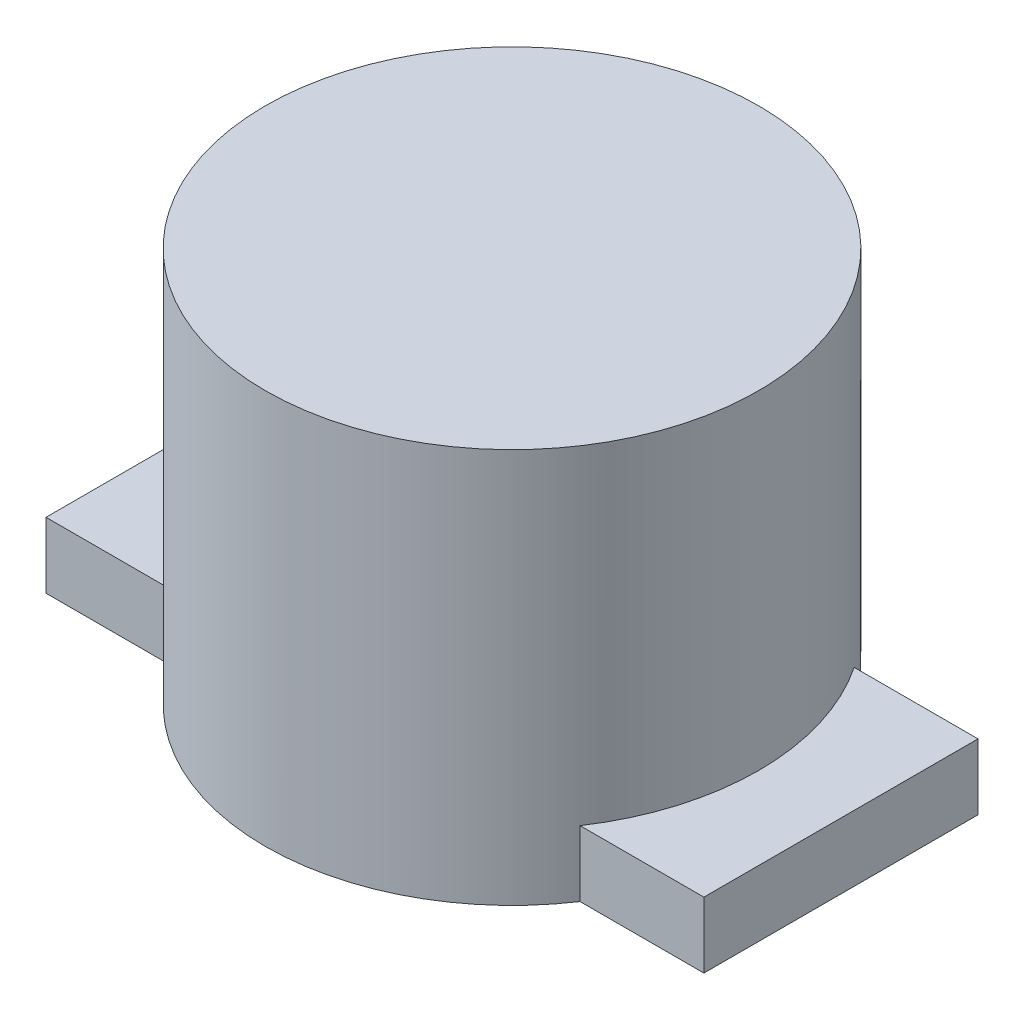
ISO-10303-21;
HEADER;
FILE_DESCRIPTION(('STEP AP214'),'2;1');
FILE_NAME('part.step','',(''),(''),'','','');
FILE_SCHEMA(('AUTOMOTIVE_DESIGN { 1 0 10303 214 1 1 1 1 }'));
ENDSEC;
DATA;
#1=APPLICATION_CONTEXT('core data for automotive mechanical design processes');
#2=APPLICATION_PROTOCOL_DEFINITION('international standard','automotive_design',2000,#1);
#3=PRODUCT_CONTEXT('',#1,'mechanical');
#4=PRODUCT('Part','Part','',(#3));
#5=PRODUCT_RELATED_PRODUCT_CATEGORY('part','',(#4));
#6=PRODUCT_DEFINITION_FORMATION('','',#4);
#7=PRODUCT_DEFINITION_CONTEXT('part definition',#1,'design');
#8=PRODUCT_DEFINITION('design','',#6,#7);
#9=PRODUCT_DEFINITION_SHAPE('','',#8);
#10=(LENGTH_UNIT() NAMED_UNIT(*) SI_UNIT(.MILLI.,.METRE.));
#11=(NAMED_UNIT(*) PLANE_ANGLE_UNIT() SI_UNIT($,.RADIAN.));
#12=(NAMED_UNIT(*) SI_UNIT($,.STERADIAN.) SOLID_ANGLE_UNIT());
#13=UNCERTAINTY_MEASURE_WITH_UNIT(LENGTH_MEASURE(1.E-05),#10,'distance_accuracy_value','');
#14=(GEOMETRIC_REPRESENTATION_CONTEXT(3) GLOBAL_UNCERTAINTY_ASSIGNED_CONTEXT((#13)) GLOBAL_UNIT_ASSIGNED_CONTEXT((#10,
#11,#12)) REPRESENTATION_CONTEXT('',''));
#15=CARTESIAN_POINT('',(0.,0.,0.));
#16=DIRECTION('',(0.,0.,1.));
#17=DIRECTION('',(1.,0.,0.));
#18=AXIS2_PLACEMENT_3D('',#15,#16,#17);
#19=CARTESIAN_POINT('',(-6.,1.2,-2.5));
#20=DIRECTION('',(0.,1.,0.));
#21=DIRECTION('',(0.,0.,1.));
#22=AXIS2_PLACEMENT_3D('',#19,#20,#21);
#23=PLANE('',#22);
#24=CARTESIAN_POINT('',(-6.,1.2,-2.5));
#25=DIRECTION('',(0.,1.,0.));
#26=DIRECTION('',(0.,0.,1.));
#27=AXIS2_PLACEMENT_3D('',#24,#25,#26);
#28=CIRCLE('',#27,4.5);
#29=CARTESIAN_POINT('',(-2.25834261322606,1.2,0.));
#30=VERTEX_POINT('',#29);
#31=CARTESIAN_POINT('',(-2.25834261322606,1.2,-5.));
#32=VERTEX_POINT('',#31);
#33=EDGE_CURVE('E165',#30,#32,#28,.T.);
#34=ORIENTED_EDGE('',*,*,#33,.F.);
#35=DIRECTION('',(1.,0.,0.));
#36=VECTOR('',#35,1.);
#37=CARTESIAN_POINT('',(-2.25834261322606,1.2,0.));
#38=LINE('',#37,#36);
#39=CARTESIAN_POINT('',(0.,1.2,0.));
#40=VERTEX_POINT('',#39);
#41=EDGE_CURVE('E153',#30,#40,#38,.T.);
#42=ORIENTED_EDGE('',*,*,#41,.T.);
#43=DIRECTION('',(0.,0.,-1.));
#44=VECTOR('',#43,1.);
#45=CARTESIAN_POINT('',(0.,1.2,0.));
#46=LINE('',#45,#44);
#47=CARTESIAN_POINT('',(0.,1.2,-5.));
#48=VERTEX_POINT('',#47);
#49=EDGE_CURVE('E99',#40,#48,#46,.T.);
#50=ORIENTED_EDGE('',*,*,#49,.T.);
#51=DIRECTION('',(-1.,0.,0.));
#52=VECTOR('',#51,1.);
#53=CARTESIAN_POINT('',(-2.25834261322606,1.2,-5.));
#54=LINE('',#53,#52);
#55=EDGE_CURVE('E119',#48,#32,#54,.T.);
#56=ORIENTED_EDGE('',*,*,#55,.T.);
#57=EDGE_LOOP('',(#34,#42,#50,#56));
#58=FACE_BOUND('',#57,.T.);
#59=ADVANCED_FACE('F35',(#58),#23,.T.);
#60=CARTESIAN_POINT('',(-2.25834261322606,1.2,0.));
#61=DIRECTION('',(0.,0.,-1.));
#62=DIRECTION('',(-1.,0.,0.));
#63=AXIS2_PLACEMENT_3D('',#60,#61,#62);
#64=PLANE('',#63);
#65=DIRECTION('',(1.,0.,0.));
#66=VECTOR('',#65,1.);
#67=CARTESIAN_POINT('',(-2.25834261322606,0.,0.));
#68=LINE('',#67,#66);
#69=CARTESIAN_POINT('',(-2.25834261322606,0.,0.));
#70=VERTEX_POINT('',#69);
#71=CARTESIAN_POINT('',(0.,0.,0.));
#72=VERTEX_POINT('',#71);
#73=EDGE_CURVE('E138',#70,#72,#68,.T.);
#74=ORIENTED_EDGE('',*,*,#73,.T.);
#75=DIRECTION('',(0.,-1.,0.));
#76=VECTOR('',#75,1.);
#77=CARTESIAN_POINT('',(0.,1.2,0.));
#78=LINE('',#77,#76);
#79=EDGE_CURVE('E45',#40,#72,#78,.T.);
#80=ORIENTED_EDGE('',*,*,#79,.F.);
#81=ORIENTED_EDGE('',*,*,#41,.F.);
#82=DIRECTION('',(0.,-1.,0.));
#83=VECTOR('',#82,1.);
#84=CARTESIAN_POINT('',(-2.25834261322606,1.2,0.));
#85=LINE('',#84,#83);
#86=EDGE_CURVE('E133',#30,#70,#85,.T.);
#87=ORIENTED_EDGE('',*,*,#86,.T.);
#88=EDGE_LOOP('',(#74,#80,#81,#87));
#89=FACE_BOUND('',#88,.T.);
#90=ADVANCED_FACE('F37',(#89),#64,.F.);
#91=CARTESIAN_POINT('',(0.,1.2,0.));
#92=DIRECTION('',(-1.,0.,0.));
#93=DIRECTION('',(0.,0.,1.));
#94=AXIS2_PLACEMENT_3D('',#91,#92,#93);
#95=PLANE('',#94);
#96=DIRECTION('',(0.,0.,-1.));
#97=VECTOR('',#96,1.);
#98=CARTESIAN_POINT('',(0.,0.,0.));
#99=LINE('',#98,#97);
#100=CARTESIAN_POINT('',(0.,0.,-5.));
#101=VERTEX_POINT('',#100);
#102=EDGE_CURVE('E141',#72,#101,#99,.T.);
#103=ORIENTED_EDGE('',*,*,#102,.T.);
#104=DIRECTION('',(0.,-1.,0.));
#105=VECTOR('',#104,1.);
#106=CARTESIAN_POINT('',(0.,1.2,-5.));
#107=LINE('',#106,#105);
#108=EDGE_CURVE('E156',#48,#101,#107,.T.);
#109=ORIENTED_EDGE('',*,*,#108,.F.);
#110=ORIENTED_EDGE('',*,*,#49,.F.);
#111=ORIENTED_EDGE('',*,*,#79,.T.);
#112=EDGE_LOOP('',(#103,#109,#110,#111));
#113=FACE_BOUND('',#112,.T.);
#114=ADVANCED_FACE('F219',(#113),#95,.F.);
#115=CARTESIAN_POINT('',(-2.25834261322606,1.2,-5.));
#116=DIRECTION('',(0.,0.,1.));
#117=DIRECTION('',(1.,0.,0.));
#118=AXIS2_PLACEMENT_3D('',#115,#116,#117);
#119=PLANE('',#118);
#120=DIRECTION('',(-1.,0.,0.));
#121=VECTOR('',#120,1.);
#122=CARTESIAN_POINT('',(-2.25834261322606,0.,-5.));
#123=LINE('',#122,#121);
#124=CARTESIAN_POINT('',(-2.25834261322606,0.,-5.));
#125=VERTEX_POINT('',#124);
#126=EDGE_CURVE('E144',#101,#125,#123,.T.);
#127=ORIENTED_EDGE('',*,*,#126,.T.);
#128=DIRECTION('',(0.,-1.,0.));
#129=VECTOR('',#128,1.);
#130=CARTESIAN_POINT('',(-2.25834261322606,1.2,-5.));
#131=LINE('',#130,#129);
#132=EDGE_CURVE('E159',#32,#125,#131,.T.);
#133=ORIENTED_EDGE('',*,*,#132,.F.);
#134=ORIENTED_EDGE('',*,*,#55,.F.);
#135=ORIENTED_EDGE('',*,*,#108,.T.);
#136=EDGE_LOOP('',(#127,#133,#134,#135));
#137=FACE_BOUND('',#136,.T.);
#138=ADVANCED_FACE('F257',(#137),#119,.F.);
#139=CARTESIAN_POINT('',(-9.74165738677394,1.2,-5.));
#140=DIRECTION('',(0.,0.,1.));
#141=DIRECTION('',(1.,0.,0.));
#142=AXIS2_PLACEMENT_3D('',#139,#140,#141);
#143=PLANE('',#142);
#144=DIRECTION('',(-1.,0.,0.));
#145=VECTOR('',#144,1.);
#146=CARTESIAN_POINT('',(-9.74165738677394,0.,-5.));
#147=LINE('',#146,#145);
#148=CARTESIAN_POINT('',(-9.74165738677394,0.,-5.));
#149=VERTEX_POINT('',#148);
#150=CARTESIAN_POINT('',(-12.,0.,-5.));
#151=VERTEX_POINT('',#150);
#152=EDGE_CURVE('E125',#149,#151,#147,.T.);
#153=ORIENTED_EDGE('',*,*,#152,.T.);
#154=DIRECTION('',(0.,-1.,0.));
#155=VECTOR('',#154,1.);
#156=CARTESIAN_POINT('',(-12.,1.2,-5.));
#157=LINE('',#156,#155);
#158=CARTESIAN_POINT('',(-12.,1.2,-5.));
#159=VERTEX_POINT('',#158);
#160=EDGE_CURVE('E122',#159,#151,#157,.T.);
#161=ORIENTED_EDGE('',*,*,#160,.F.);
#162=DIRECTION('',(-1.,0.,0.));
#163=VECTOR('',#162,1.);
#164=CARTESIAN_POINT('',(-9.74165738677394,1.2,-5.));
#165=LINE('',#164,#163);
#166=CARTESIAN_POINT('',(-9.74165738677394,1.2,-5.));
#167=VERTEX_POINT('',#166);
#168=EDGE_CURVE('E110',#167,#159,#165,.T.);
#169=ORIENTED_EDGE('',*,*,#168,.F.);
#170=DIRECTION('',(0.,-1.,0.));
#171=VECTOR('',#170,1.);
#172=CARTESIAN_POINT('',(-9.74165738677394,1.2,-5.));
#173=LINE('',#172,#171);
#174=EDGE_CURVE('E128',#167,#149,#173,.T.);
#175=ORIENTED_EDGE('',*,*,#174,.T.);
#176=EDGE_LOOP('',(#153,#161,#169,#175));
#177=FACE_BOUND('',#176,.T.);
#178=ADVANCED_FACE('F123',(#177),#143,.F.);
#179=CARTESIAN_POINT('',(-12.,1.2,0.));
#180=DIRECTION('',(1.,0.,0.));
#181=DIRECTION('',(0.,0.,-1.));
#182=AXIS2_PLACEMENT_3D('',#179,#180,#181);
#183=PLANE('',#182);
#184=DIRECTION('',(0.,0.,1.));
#185=VECTOR('',#184,1.);
#186=CARTESIAN_POINT('',(-12.,0.,0.));
#187=LINE('',#186,#185);
#188=CARTESIAN_POINT('',(-12.,0.,0.));
#189=VERTEX_POINT('',#188);
#190=EDGE_CURVE('E149',#151,#189,#187,.T.);
#191=ORIENTED_EDGE('',*,*,#190,.T.);
#192=DIRECTION('',(0.,-1.,0.));
#193=VECTOR('',#192,1.);
#194=CARTESIAN_POINT('',(-12.,1.2,0.));
#195=LINE('',#194,#193);
#196=CARTESIAN_POINT('',(-12.,1.2,0.));
#197=VERTEX_POINT('',#196);
#198=EDGE_CURVE('E129',#197,#189,#195,.T.);
#199=ORIENTED_EDGE('',*,*,#198,.F.);
#200=DIRECTION('',(0.,0.,1.));
#201=VECTOR('',#200,1.);
#202=CARTESIAN_POINT('',(-12.,1.2,0.));
#203=LINE('',#202,#201);
#204=EDGE_CURVE('E114',#159,#197,#203,.T.);
#205=ORIENTED_EDGE('',*,*,#204,.F.);
#206=ORIENTED_EDGE('',*,*,#160,.T.);
#207=EDGE_LOOP('',(#191,#199,#205,#206));
#208=FACE_BOUND('',#207,.T.);
#209=ADVANCED_FACE('F131',(#208),#183,.F.);
#210=CARTESIAN_POINT('',(-12.,1.2,0.));
#211=DIRECTION('',(0.,0.,-1.));
#212=DIRECTION('',(-1.,0.,0.));
#213=AXIS2_PLACEMENT_3D('',#210,#211,#212);
#214=PLANE('',#213);
#215=DIRECTION('',(1.,0.,0.));
#216=VECTOR('',#215,1.);
#217=CARTESIAN_POINT('',(-12.,0.,0.));
#218=LINE('',#217,#216);
#219=CARTESIAN_POINT('',(-9.74165738677394,0.,0.));
#220=VERTEX_POINT('',#219);
#221=EDGE_CURVE('E83',#189,#220,#218,.T.);
#222=ORIENTED_EDGE('',*,*,#221,.T.);
#223=DIRECTION('',(0.,-1.,0.));
#224=VECTOR('',#223,1.);
#225=CARTESIAN_POINT('',(-9.74165738677394,1.2,0.));
#226=LINE('',#225,#224);
#227=CARTESIAN_POINT('',(-9.74165738677394,1.2,0.));
#228=VERTEX_POINT('',#227);
#229=EDGE_CURVE('E154',#228,#220,#226,.T.);
#230=ORIENTED_EDGE('',*,*,#229,.F.);
#231=DIRECTION('',(1.,0.,0.));
#232=VECTOR('',#231,1.);
#233=CARTESIAN_POINT('',(-12.,1.2,0.));
#234=LINE('',#233,#232);
#235=EDGE_CURVE('E54',#197,#228,#234,.T.);
#236=ORIENTED_EDGE('',*,*,#235,.F.);
#237=ORIENTED_EDGE('',*,*,#198,.T.);
#238=EDGE_LOOP('',(#222,#230,#236,#237));
#239=FACE_BOUND('',#238,.T.);
#240=ADVANCED_FACE('F196',(#239),#214,.F.);
#241=CARTESIAN_POINT('',(-6.,1.2,-2.5));
#242=DIRECTION('',(0.,-1.,0.));
#243=DIRECTION('',(0.,0.,-1.));
#244=AXIS2_PLACEMENT_3D('',#241,#242,#243);
#245=CYLINDRICAL_SURFACE('',#244,4.5);
#246=CARTESIAN_POINT('',(-6.,0.,-2.5));
#247=DIRECTION('',(0.,1.,0.));
#248=DIRECTION('',(0.,0.,1.));
#249=AXIS2_PLACEMENT_3D('',#246,#247,#248);
#250=CIRCLE('',#249,4.5);
#251=EDGE_CURVE('E90',#220,#70,#250,.T.);
#252=ORIENTED_EDGE('',*,*,#251,.T.);
#253=ORIENTED_EDGE('',*,*,#86,.F.);
#254=ORIENTED_EDGE('',*,*,#33,.T.);
#255=ORIENTED_EDGE('',*,*,#132,.T.);
#256=CARTESIAN_POINT('',(-6.,0.,-2.5));
#257=DIRECTION('',(0.,1.,0.));
#258=DIRECTION('',(0.,0.,1.));
#259=AXIS2_PLACEMENT_3D('',#256,#257,#258);
#260=CIRCLE('',#259,4.5);
#261=EDGE_CURVE('E146',#125,#149,#260,.T.);
#262=ORIENTED_EDGE('',*,*,#261,.T.);
#263=ORIENTED_EDGE('',*,*,#174,.F.);
#264=EDGE_CURVE('E11',#167,#228,#28,.T.);
#265=ORIENTED_EDGE('',*,*,#264,.T.);
#266=ORIENTED_EDGE('',*,*,#229,.T.);
#267=EDGE_LOOP('',(#252,#253,#254,#255,#262,#263,#265,#266));
#268=FACE_BOUND('',#267,.T.);
#269=CARTESIAN_POINT('',(-6.,7.2,-2.5));
#270=DIRECTION('',(0.,1.,0.));
#271=DIRECTION('',(0.,0.,1.));
#272=AXIS2_PLACEMENT_3D('',#269,#270,#271);
#273=CIRCLE('',#272,4.5);
#274=CARTESIAN_POINT('',(-6.,7.2,2.));
#275=VERTEX_POINT('',#274);
#276=EDGE_CURVE('E142',#275,#275,#273,.T.);
#277=ORIENTED_EDGE('',*,*,#276,.F.);
#278=EDGE_LOOP('',(#277));
#279=FACE_BOUND('',#278,.T.);
#280=ADVANCED_FACE('F187',(#268,#279),#245,.T.);
#281=ORIENTED_EDGE('',*,*,#264,.F.);
#282=ORIENTED_EDGE('',*,*,#168,.T.);
#283=ORIENTED_EDGE('',*,*,#204,.T.);
#284=ORIENTED_EDGE('',*,*,#235,.T.);
#285=EDGE_LOOP('',(#281,#282,#283,#284));
#286=FACE_BOUND('',#285,.T.);
#287=ADVANCED_FACE('F112',(#286),#23,.T.);
#288=CARTESIAN_POINT('',(-6.,0.,-2.5));
#289=DIRECTION('',(0.,1.,0.));
#290=DIRECTION('',(0.,0.,1.));
#291=AXIS2_PLACEMENT_3D('',#288,#289,#290);
#292=PLANE('',#291);
#293=ORIENTED_EDGE('',*,*,#73,.F.);
#294=ORIENTED_EDGE('',*,*,#251,.F.);
#295=ORIENTED_EDGE('',*,*,#221,.F.);
#296=ORIENTED_EDGE('',*,*,#190,.F.);
#297=ORIENTED_EDGE('',*,*,#152,.F.);
#298=ORIENTED_EDGE('',*,*,#261,.F.);
#299=ORIENTED_EDGE('',*,*,#126,.F.);
#300=ORIENTED_EDGE('',*,*,#102,.F.);
#301=EDGE_LOOP('',(#293,#294,#295,#296,#297,#298,#299,#300));
#302=FACE_BOUND('',#301,.T.);
#303=ADVANCED_FACE('F195',(#302),#292,.F.);
#304=CARTESIAN_POINT('',(-6.,7.2,-2.5));
#305=DIRECTION('',(0.,1.,0.));
#306=DIRECTION('',(0.,0.,1.));
#307=AXIS2_PLACEMENT_3D('',#304,#305,#306);
#308=PLANE('',#307);
#309=ORIENTED_EDGE('',*,*,#276,.T.);
#310=EDGE_LOOP('',(#309));
#311=FACE_BOUND('',#310,.T.);
#312=ADVANCED_FACE('F205',(#311),#308,.T.);
#313=CLOSED_SHELL('',(#59,#90,#114,#138,#178,#209,#240,#280,#287,#303,#312));
#314=MANIFOLD_SOLID_BREP('B2',#313);
#315=ADVANCED_BREP_SHAPE_REPRESENTATION('',(#18,#314),#14);
#316=SHAPE_DEFINITION_REPRESENTATION(#9,#315);
ENDSEC;
END-ISO-10303-21;
